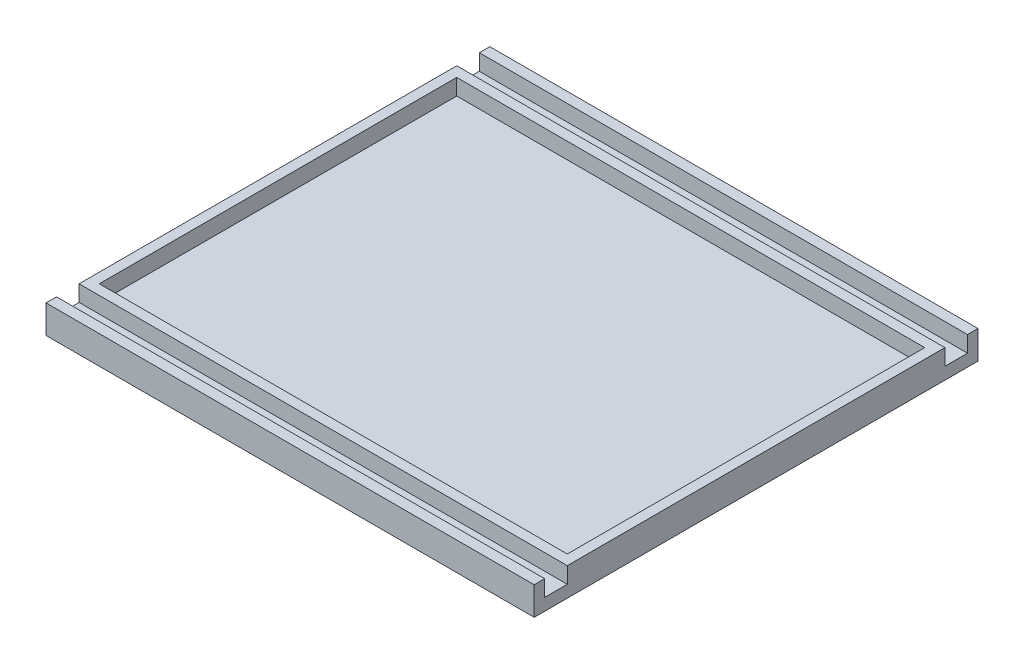
ISO-10303-21;
HEADER;
FILE_DESCRIPTION(('STEP AP214'),'2;1');
FILE_NAME('part.step','',(''),(''),'','','');
FILE_SCHEMA(('AUTOMOTIVE_DESIGN { 1 0 10303 214 1 1 1 1 }'));
ENDSEC;
DATA;
#1=APPLICATION_CONTEXT('core data for automotive mechanical design processes');
#2=APPLICATION_PROTOCOL_DEFINITION('international standard','automotive_design',2000,#1);
#3=PRODUCT_CONTEXT('',#1,'mechanical');
#4=PRODUCT('Part','Part','',(#3));
#5=PRODUCT_RELATED_PRODUCT_CATEGORY('part','',(#4));
#6=PRODUCT_DEFINITION_FORMATION('','',#4);
#7=PRODUCT_DEFINITION_CONTEXT('part definition',#1,'design');
#8=PRODUCT_DEFINITION('design','',#6,#7);
#9=PRODUCT_DEFINITION_SHAPE('','',#8);
#10=(LENGTH_UNIT() NAMED_UNIT(*) SI_UNIT(.MILLI.,.METRE.));
#11=(NAMED_UNIT(*) PLANE_ANGLE_UNIT() SI_UNIT($,.RADIAN.));
#12=(NAMED_UNIT(*) SI_UNIT($,.STERADIAN.) SOLID_ANGLE_UNIT());
#13=UNCERTAINTY_MEASURE_WITH_UNIT(LENGTH_MEASURE(1.E-05),#10,'distance_accuracy_value','');
#14=(GEOMETRIC_REPRESENTATION_CONTEXT(3) GLOBAL_UNCERTAINTY_ASSIGNED_CONTEXT((#13)) GLOBAL_UNIT_ASSIGNED_CONTEXT((#10,
#11,#12)) REPRESENTATION_CONTEXT('',''));
#15=CARTESIAN_POINT('',(0.,0.,0.));
#16=DIRECTION('',(0.,0.,1.));
#17=DIRECTION('',(1.,0.,0.));
#18=AXIS2_PLACEMENT_3D('',#15,#16,#17);
#19=CARTESIAN_POINT('',(0.,1.5,0.));
#20=DIRECTION('',(0.,1.,0.));
#21=DIRECTION('',(0.,0.,1.));
#22=AXIS2_PLACEMENT_3D('',#19,#20,#21);
#23=PLANE('',#22);
#24=DIRECTION('',(0.,0.,1.));
#25=VECTOR('',#24,1.);
#26=CARTESIAN_POINT('',(-30.25,1.5,-27.5));
#27=LINE('',#26,#25);
#28=CARTESIAN_POINT('',(-30.25,1.5,23.4));
#29=VERTEX_POINT('',#28);
#30=CARTESIAN_POINT('',(-30.25,1.5,26.2));
#31=VERTEX_POINT('',#30);
#32=EDGE_CURVE('E262',#29,#31,#27,.T.);
#33=ORIENTED_EDGE('',*,*,#32,.T.);
#34=DIRECTION('',(-1.,0.,0.));
#35=VECTOR('',#34,1.);
#36=CARTESIAN_POINT('',(30.25,1.5,26.2));
#37=LINE('',#36,#35);
#38=CARTESIAN_POINT('',(30.25,1.5,26.2));
#39=VERTEX_POINT('',#38);
#40=EDGE_CURVE('E177',#39,#31,#37,.T.);
#41=ORIENTED_EDGE('',*,*,#40,.F.);
#42=DIRECTION('',(0.,0.,1.));
#43=VECTOR('',#42,1.);
#44=CARTESIAN_POINT('',(30.25,1.5,-27.5));
#45=LINE('',#44,#43);
#46=CARTESIAN_POINT('',(30.25,1.5,23.4));
#47=VERTEX_POINT('',#46);
#48=EDGE_CURVE('E62',#47,#39,#45,.T.);
#49=ORIENTED_EDGE('',*,*,#48,.F.);
#50=DIRECTION('',(1.,0.,0.));
#51=VECTOR('',#50,1.);
#52=CARTESIAN_POINT('',(-30.25,1.5,23.4));
#53=LINE('',#52,#51);
#54=EDGE_CURVE('E238',#29,#47,#53,.T.);
#55=ORIENTED_EDGE('',*,*,#54,.F.);
#56=EDGE_LOOP('',(#33,#41,#49,#55));
#57=FACE_BOUND('',#56,.T.);
#58=ADVANCED_FACE('F39',(#57),#23,.T.);
#59=CARTESIAN_POINT('',(30.25,1.5,-26.2));
#60=VERTEX_POINT('',#59);
#61=CARTESIAN_POINT('',(30.25,1.5,-23.4));
#62=VERTEX_POINT('',#61);
#63=EDGE_CURVE('E263',#60,#62,#45,.T.);
#64=ORIENTED_EDGE('',*,*,#63,.F.);
#65=DIRECTION('',(1.,0.,0.));
#66=VECTOR('',#65,1.);
#67=CARTESIAN_POINT('',(-30.25,1.5,-26.2));
#68=LINE('',#67,#66);
#69=CARTESIAN_POINT('',(-30.25,1.5,-26.2));
#70=VERTEX_POINT('',#69);
#71=EDGE_CURVE('E185',#70,#60,#68,.T.);
#72=ORIENTED_EDGE('',*,*,#71,.F.);
#73=CARTESIAN_POINT('',(-30.25,1.5,-23.4));
#74=VERTEX_POINT('',#73);
#75=EDGE_CURVE('E260',#70,#74,#27,.T.);
#76=ORIENTED_EDGE('',*,*,#75,.T.);
#77=DIRECTION('',(-1.,0.,0.));
#78=VECTOR('',#77,1.);
#79=CARTESIAN_POINT('',(-30.25,1.5,-23.4));
#80=LINE('',#79,#78);
#81=EDGE_CURVE('E233',#62,#74,#80,.T.);
#82=ORIENTED_EDGE('',*,*,#81,.F.);
#83=EDGE_LOOP('',(#64,#72,#76,#82));
#84=FACE_BOUND('',#83,.T.);
#85=ADVANCED_FACE('F295',(#84),#23,.T.);
#86=CARTESIAN_POINT('',(-30.25,1.5,-27.5));
#87=DIRECTION('',(1.,0.,0.));
#88=DIRECTION('',(0.,0.,-1.));
#89=AXIS2_PLACEMENT_3D('',#86,#87,#88);
#90=PLANE('',#89);
#91=DIRECTION('',(0.,0.,1.));
#92=VECTOR('',#91,1.);
#93=CARTESIAN_POINT('',(-30.25,0.,-27.5));
#94=LINE('',#93,#92);
#95=CARTESIAN_POINT('',(-30.25,0.,-27.5));
#96=VERTEX_POINT('',#95);
#97=CARTESIAN_POINT('',(-30.25,0.,27.5));
#98=VERTEX_POINT('',#97);
#99=EDGE_CURVE('E259',#96,#98,#94,.T.);
#100=ORIENTED_EDGE('',*,*,#99,.T.);
#101=DIRECTION('',(0.,-1.,0.));
#102=VECTOR('',#101,1.);
#103=CARTESIAN_POINT('',(-30.25,1.5,27.5));
#104=LINE('',#103,#102);
#105=CARTESIAN_POINT('',(-30.25,3.5,27.5));
#106=VERTEX_POINT('',#105);
#107=EDGE_CURVE('E11',#106,#98,#104,.T.);
#108=ORIENTED_EDGE('',*,*,#107,.F.);
#109=DIRECTION('',(0.,0.,1.));
#110=VECTOR('',#109,1.);
#111=CARTESIAN_POINT('',(-30.25,3.5,27.5));
#112=LINE('',#111,#110);
#113=CARTESIAN_POINT('',(-30.25,3.5,26.2));
#114=VERTEX_POINT('',#113);
#115=EDGE_CURVE('E174',#114,#106,#112,.T.);
#116=ORIENTED_EDGE('',*,*,#115,.F.);
#117=DIRECTION('',(0.,-1.,0.));
#118=VECTOR('',#117,1.);
#119=CARTESIAN_POINT('',(-30.25,64.0139653303268,26.2));
#120=LINE('',#119,#118);
#121=EDGE_CURVE('E175',#114,#31,#120,.T.);
#122=ORIENTED_EDGE('',*,*,#121,.T.);
#123=ORIENTED_EDGE('',*,*,#32,.F.);
#124=DIRECTION('',(0.,-1.,0.));
#125=VECTOR('',#124,1.);
#126=CARTESIAN_POINT('',(-30.25,3.5,23.4));
#127=LINE('',#126,#125);
#128=CARTESIAN_POINT('',(-30.25,3.5,23.4));
#129=VERTEX_POINT('',#128);
#130=EDGE_CURVE('E250',#129,#29,#127,.T.);
#131=ORIENTED_EDGE('',*,*,#130,.F.);
#132=DIRECTION('',(0.,0.,1.));
#133=VECTOR('',#132,1.);
#134=CARTESIAN_POINT('',(-30.25,3.5,-23.4));
#135=LINE('',#134,#133);
#136=CARTESIAN_POINT('',(-30.25,3.5,-23.4));
#137=VERTEX_POINT('',#136);
#138=EDGE_CURVE('E240',#137,#129,#135,.T.);
#139=ORIENTED_EDGE('',*,*,#138,.F.);
#140=DIRECTION('',(0.,-1.,0.));
#141=VECTOR('',#140,1.);
#142=CARTESIAN_POINT('',(-30.25,3.5,-23.4));
#143=LINE('',#142,#141);
#144=EDGE_CURVE('E253',#137,#74,#143,.T.);
#145=ORIENTED_EDGE('',*,*,#144,.T.);
#146=ORIENTED_EDGE('',*,*,#75,.F.);
#147=DIRECTION('',(0.,-1.,0.));
#148=VECTOR('',#147,1.);
#149=CARTESIAN_POINT('',(-30.25,64.0139653303268,-26.2));
#150=LINE('',#149,#148);
#151=CARTESIAN_POINT('',(-30.25,3.5,-26.2));
#152=VERTEX_POINT('',#151);
#153=EDGE_CURVE('E189',#152,#70,#150,.T.);
#154=ORIENTED_EDGE('',*,*,#153,.F.);
#155=DIRECTION('',(0.,0.,1.));
#156=VECTOR('',#155,1.);
#157=CARTESIAN_POINT('',(-30.25,3.5,-27.5));
#158=LINE('',#157,#156);
#159=CARTESIAN_POINT('',(-30.25,3.5,-27.5));
#160=VERTEX_POINT('',#159);
#161=EDGE_CURVE('E197',#160,#152,#158,.T.);
#162=ORIENTED_EDGE('',*,*,#161,.F.);
#163=DIRECTION('',(0.,-1.,0.));
#164=VECTOR('',#163,1.);
#165=CARTESIAN_POINT('',(-30.25,1.5,-27.5));
#166=LINE('',#165,#164);
#167=EDGE_CURVE('E265',#160,#96,#166,.T.);
#168=ORIENTED_EDGE('',*,*,#167,.T.);
#169=EDGE_LOOP('',(#100,#108,#116,#122,#123,#131,#139,#145,#146,#154,#162,#168));
#170=FACE_BOUND('',#169,.T.);
#171=ADVANCED_FACE('F41',(#170),#90,.F.);
#172=CARTESIAN_POINT('',(-30.25,1.5,27.5));
#173=DIRECTION('',(0.,0.,-1.));
#174=DIRECTION('',(-1.,0.,0.));
#175=AXIS2_PLACEMENT_3D('',#172,#173,#174);
#176=PLANE('',#175);
#177=DIRECTION('',(1.,0.,0.));
#178=VECTOR('',#177,1.);
#179=CARTESIAN_POINT('',(-30.25,0.,27.5));
#180=LINE('',#179,#178);
#181=CARTESIAN_POINT('',(30.25,0.,27.5));
#182=VERTEX_POINT('',#181);
#183=EDGE_CURVE('E159',#98,#182,#180,.T.);
#184=ORIENTED_EDGE('',*,*,#183,.T.);
#185=DIRECTION('',(0.,-1.,0.));
#186=VECTOR('',#185,1.);
#187=CARTESIAN_POINT('',(30.25,1.5,27.5));
#188=LINE('',#187,#186);
#189=CARTESIAN_POINT('',(30.25,3.5,27.5));
#190=VERTEX_POINT('',#189);
#191=EDGE_CURVE('E47',#190,#182,#188,.T.);
#192=ORIENTED_EDGE('',*,*,#191,.F.);
#193=DIRECTION('',(1.,0.,0.));
#194=VECTOR('',#193,1.);
#195=CARTESIAN_POINT('',(30.25,3.5,27.5));
#196=LINE('',#195,#194);
#197=EDGE_CURVE('E157',#106,#190,#196,.T.);
#198=ORIENTED_EDGE('',*,*,#197,.F.);
#199=ORIENTED_EDGE('',*,*,#107,.T.);
#200=EDGE_LOOP('',(#184,#192,#198,#199));
#201=FACE_BOUND('',#200,.T.);
#202=ADVANCED_FACE('F155',(#201),#176,.F.);
#203=CARTESIAN_POINT('',(30.25,1.5,-27.5));
#204=DIRECTION('',(1.,0.,0.));
#205=DIRECTION('',(0.,0.,-1.));
#206=AXIS2_PLACEMENT_3D('',#203,#204,#205);
#207=PLANE('',#206);
#208=DIRECTION('',(0.,0.,1.));
#209=VECTOR('',#208,1.);
#210=CARTESIAN_POINT('',(30.25,0.,-27.5));
#211=LINE('',#210,#209);
#212=CARTESIAN_POINT('',(30.25,0.,-27.5));
#213=VERTEX_POINT('',#212);
#214=EDGE_CURVE('E269',#213,#182,#211,.T.);
#215=ORIENTED_EDGE('',*,*,#214,.F.);
#216=DIRECTION('',(0.,-1.,0.));
#217=VECTOR('',#216,1.);
#218=CARTESIAN_POINT('',(30.25,1.5,-27.5));
#219=LINE('',#218,#217);
#220=CARTESIAN_POINT('',(30.25,3.5,-27.5));
#221=VERTEX_POINT('',#220);
#222=EDGE_CURVE('E163',#221,#213,#219,.T.);
#223=ORIENTED_EDGE('',*,*,#222,.F.);
#224=DIRECTION('',(0.,0.,-1.));
#225=VECTOR('',#224,1.);
#226=CARTESIAN_POINT('',(30.25,3.5,-27.5));
#227=LINE('',#226,#225);
#228=CARTESIAN_POINT('',(30.25,3.5,-26.2));
#229=VERTEX_POINT('',#228);
#230=EDGE_CURVE('E190',#229,#221,#227,.T.);
#231=ORIENTED_EDGE('',*,*,#230,.F.);
#232=DIRECTION('',(0.,-1.,0.));
#233=VECTOR('',#232,1.);
#234=CARTESIAN_POINT('',(30.25,64.0139653303268,-26.2));
#235=LINE('',#234,#233);
#236=EDGE_CURVE('E188',#229,#60,#235,.T.);
#237=ORIENTED_EDGE('',*,*,#236,.T.);
#238=ORIENTED_EDGE('',*,*,#63,.T.);
#239=DIRECTION('',(0.,-1.,0.));
#240=VECTOR('',#239,1.);
#241=CARTESIAN_POINT('',(30.25,3.5,-23.4));
#242=LINE('',#241,#240);
#243=CARTESIAN_POINT('',(30.25,3.5,-23.4));
#244=VERTEX_POINT('',#243);
#245=EDGE_CURVE('E256',#244,#62,#242,.T.);
#246=ORIENTED_EDGE('',*,*,#245,.F.);
#247=DIRECTION('',(0.,0.,-1.));
#248=VECTOR('',#247,1.);
#249=CARTESIAN_POINT('',(30.25,3.5,-23.4));
#250=LINE('',#249,#248);
#251=CARTESIAN_POINT('',(30.25,3.5,23.4));
#252=VERTEX_POINT('',#251);
#253=EDGE_CURVE('E234',#252,#244,#250,.T.);
#254=ORIENTED_EDGE('',*,*,#253,.F.);
#255=DIRECTION('',(0.,-1.,0.));
#256=VECTOR('',#255,1.);
#257=CARTESIAN_POINT('',(30.25,3.5,23.4));
#258=LINE('',#257,#256);
#259=EDGE_CURVE('E244',#252,#47,#258,.T.);
#260=ORIENTED_EDGE('',*,*,#259,.T.);
#261=ORIENTED_EDGE('',*,*,#48,.T.);
#262=DIRECTION('',(0.,-1.,0.));
#263=VECTOR('',#262,1.);
#264=CARTESIAN_POINT('',(30.25,64.0139653303268,26.2));
#265=LINE('',#264,#263);
#266=CARTESIAN_POINT('',(30.25,3.5,26.2));
#267=VERTEX_POINT('',#266);
#268=EDGE_CURVE('E168',#267,#39,#265,.T.);
#269=ORIENTED_EDGE('',*,*,#268,.F.);
#270=DIRECTION('',(0.,0.,-1.));
#271=VECTOR('',#270,1.);
#272=CARTESIAN_POINT('',(30.25,3.5,27.5));
#273=LINE('',#272,#271);
#274=EDGE_CURVE('E166',#190,#267,#273,.T.);
#275=ORIENTED_EDGE('',*,*,#274,.F.);
#276=ORIENTED_EDGE('',*,*,#191,.T.);
#277=EDGE_LOOP('',(#215,#223,#231,#237,#238,#246,#254,#260,#261,#269,#275,#276));
#278=FACE_BOUND('',#277,.T.);
#279=ADVANCED_FACE('F167',(#278),#207,.T.);
#280=CARTESIAN_POINT('',(-30.25,1.5,-27.5));
#281=DIRECTION('',(0.,0.,-1.));
#282=DIRECTION('',(-1.,0.,0.));
#283=AXIS2_PLACEMENT_3D('',#280,#281,#282);
#284=PLANE('',#283);
#285=DIRECTION('',(1.,0.,0.));
#286=VECTOR('',#285,1.);
#287=CARTESIAN_POINT('',(-30.25,0.,-27.5));
#288=LINE('',#287,#286);
#289=EDGE_CURVE('E271',#96,#213,#288,.T.);
#290=ORIENTED_EDGE('',*,*,#289,.F.);
#291=ORIENTED_EDGE('',*,*,#167,.F.);
#292=DIRECTION('',(-1.,0.,0.));
#293=VECTOR('',#292,1.);
#294=CARTESIAN_POINT('',(-30.25,3.5,-27.5));
#295=LINE('',#294,#293);
#296=EDGE_CURVE('E200',#221,#160,#295,.T.);
#297=ORIENTED_EDGE('',*,*,#296,.F.);
#298=ORIENTED_EDGE('',*,*,#222,.T.);
#299=EDGE_LOOP('',(#290,#291,#297,#298));
#300=FACE_BOUND('',#299,.T.);
#301=ADVANCED_FACE('F278',(#300),#284,.T.);
#302=CARTESIAN_POINT('',(0.,0.,0.));
#303=DIRECTION('',(0.,1.,0.));
#304=DIRECTION('',(0.,0.,1.));
#305=AXIS2_PLACEMENT_3D('',#302,#303,#304);
#306=PLANE('',#305);
#307=ORIENTED_EDGE('',*,*,#99,.F.);
#308=ORIENTED_EDGE('',*,*,#289,.T.);
#309=ORIENTED_EDGE('',*,*,#214,.T.);
#310=ORIENTED_EDGE('',*,*,#183,.F.);
#311=EDGE_LOOP('',(#307,#308,#309,#310));
#312=FACE_BOUND('',#311,.T.);
#313=ADVANCED_FACE('F281',(#312),#306,.F.);
#314=CARTESIAN_POINT('',(0.,3.5,0.));
#315=DIRECTION('',(0.,1.,0.));
#316=DIRECTION('',(0.,0.,1.));
#317=AXIS2_PLACEMENT_3D('',#314,#315,#316);
#318=PLANE('',#317);
#319=ORIENTED_EDGE('',*,*,#253,.T.);
#320=DIRECTION('',(-1.,0.,0.));
#321=VECTOR('',#320,1.);
#322=CARTESIAN_POINT('',(-30.25,3.5,-23.4));
#323=LINE('',#322,#321);
#324=EDGE_CURVE('E237',#244,#137,#323,.T.);
#325=ORIENTED_EDGE('',*,*,#324,.T.);
#326=ORIENTED_EDGE('',*,*,#138,.T.);
#327=DIRECTION('',(1.,0.,0.));
#328=VECTOR('',#327,1.);
#329=CARTESIAN_POINT('',(-30.25,3.5,23.4));
#330=LINE('',#329,#328);
#331=EDGE_CURVE('E242',#129,#252,#330,.T.);
#332=ORIENTED_EDGE('',*,*,#331,.T.);
#333=EDGE_LOOP('',(#319,#325,#326,#332));
#334=FACE_BOUND('',#333,.T.);
#335=DIRECTION('',(-1.,0.,0.));
#336=VECTOR('',#335,1.);
#337=CARTESIAN_POINT('',(-29.,3.5,-22.15));
#338=LINE('',#337,#336);
#339=CARTESIAN_POINT('',(29.,3.5,-22.15));
#340=VERTEX_POINT('',#339);
#341=CARTESIAN_POINT('',(-29.,3.5,-22.15));
#342=VERTEX_POINT('',#341);
#343=EDGE_CURVE('E207',#340,#342,#338,.T.);
#344=ORIENTED_EDGE('',*,*,#343,.F.);
#345=DIRECTION('',(0.,0.,-1.));
#346=VECTOR('',#345,1.);
#347=CARTESIAN_POINT('',(29.,3.5,-22.15));
#348=LINE('',#347,#346);
#349=CARTESIAN_POINT('',(29.,3.5,22.15));
#350=VERTEX_POINT('',#349);
#351=EDGE_CURVE('E205',#350,#340,#348,.T.);
#352=ORIENTED_EDGE('',*,*,#351,.F.);
#353=DIRECTION('',(1.,0.,0.));
#354=VECTOR('',#353,1.);
#355=CARTESIAN_POINT('',(-29.,3.5,22.15));
#356=LINE('',#355,#354);
#357=CARTESIAN_POINT('',(-29.,3.5,22.15));
#358=VERTEX_POINT('',#357);
#359=EDGE_CURVE('E213',#358,#350,#356,.T.);
#360=ORIENTED_EDGE('',*,*,#359,.F.);
#361=DIRECTION('',(0.,0.,1.));
#362=VECTOR('',#361,1.);
#363=CARTESIAN_POINT('',(-29.,3.5,-22.15));
#364=LINE('',#363,#362);
#365=EDGE_CURVE('E210',#342,#358,#364,.T.);
#366=ORIENTED_EDGE('',*,*,#365,.F.);
#367=EDGE_LOOP('',(#344,#352,#360,#366));
#368=FACE_BOUND('',#367,.T.);
#369=ADVANCED_FACE('F303',(#334,#368),#318,.T.);
#370=CARTESIAN_POINT('',(-30.25,3.5,-23.4));
#371=DIRECTION('',(0.,0.,1.));
#372=DIRECTION('',(1.,0.,0.));
#373=AXIS2_PLACEMENT_3D('',#370,#371,#372);
#374=PLANE('',#373);
#375=ORIENTED_EDGE('',*,*,#81,.T.);
#376=ORIENTED_EDGE('',*,*,#144,.F.);
#377=ORIENTED_EDGE('',*,*,#324,.F.);
#378=ORIENTED_EDGE('',*,*,#245,.T.);
#379=EDGE_LOOP('',(#375,#376,#377,#378));
#380=FACE_BOUND('',#379,.T.);
#381=ADVANCED_FACE('F299',(#380),#374,.F.);
#382=CARTESIAN_POINT('',(-30.25,3.5,23.4));
#383=DIRECTION('',(0.,0.,-1.));
#384=DIRECTION('',(-1.,0.,0.));
#385=AXIS2_PLACEMENT_3D('',#382,#383,#384);
#386=PLANE('',#385);
#387=ORIENTED_EDGE('',*,*,#54,.T.);
#388=ORIENTED_EDGE('',*,*,#259,.F.);
#389=ORIENTED_EDGE('',*,*,#331,.F.);
#390=ORIENTED_EDGE('',*,*,#130,.T.);
#391=EDGE_LOOP('',(#387,#388,#389,#390));
#392=FACE_BOUND('',#391,.T.);
#393=ADVANCED_FACE('F309',(#392),#386,.F.);
#394=CARTESIAN_POINT('',(29.,3.5,-22.15));
#395=DIRECTION('',(-1.,0.,0.));
#396=DIRECTION('',(0.,0.,1.));
#397=AXIS2_PLACEMENT_3D('',#394,#395,#396);
#398=PLANE('',#397);
#399=DIRECTION('',(0.,0.,-1.));
#400=VECTOR('',#399,1.);
#401=CARTESIAN_POINT('',(29.,1.5,-22.15));
#402=LINE('',#401,#400);
#403=CARTESIAN_POINT('',(29.,1.5,22.15));
#404=VERTEX_POINT('',#403);
#405=CARTESIAN_POINT('',(29.,1.5,-22.15));
#406=VERTEX_POINT('',#405);
#407=EDGE_CURVE('E193',#404,#406,#402,.T.);
#408=ORIENTED_EDGE('',*,*,#407,.F.);
#409=DIRECTION('',(0.,-1.,0.));
#410=VECTOR('',#409,1.);
#411=CARTESIAN_POINT('',(29.,3.5,22.15));
#412=LINE('',#411,#410);
#413=EDGE_CURVE('E54',#350,#404,#412,.T.);
#414=ORIENTED_EDGE('',*,*,#413,.F.);
#415=ORIENTED_EDGE('',*,*,#351,.T.);
#416=DIRECTION('',(0.,-1.,0.));
#417=VECTOR('',#416,1.);
#418=CARTESIAN_POINT('',(29.,3.5,-22.15));
#419=LINE('',#418,#417);
#420=EDGE_CURVE('E230',#340,#406,#419,.T.);
#421=ORIENTED_EDGE('',*,*,#420,.T.);
#422=EDGE_LOOP('',(#408,#414,#415,#421));
#423=FACE_BOUND('',#422,.T.);
#424=ADVANCED_FACE('F350',(#423),#398,.T.);
#425=CARTESIAN_POINT('',(-29.,3.5,-22.15));
#426=DIRECTION('',(0.,0.,1.));
#427=DIRECTION('',(1.,0.,0.));
#428=AXIS2_PLACEMENT_3D('',#425,#426,#427);
#429=PLANE('',#428);
#430=DIRECTION('',(-1.,0.,0.));
#431=VECTOR('',#430,1.);
#432=CARTESIAN_POINT('',(-29.,1.5,-22.15));
#433=LINE('',#432,#431);
#434=CARTESIAN_POINT('',(-29.,1.5,-22.15));
#435=VERTEX_POINT('',#434);
#436=EDGE_CURVE('E217',#406,#435,#433,.T.);
#437=ORIENTED_EDGE('',*,*,#436,.F.);
#438=ORIENTED_EDGE('',*,*,#420,.F.);
#439=ORIENTED_EDGE('',*,*,#343,.T.);
#440=DIRECTION('',(0.,-1.,0.));
#441=VECTOR('',#440,1.);
#442=CARTESIAN_POINT('',(-29.,3.5,-22.15));
#443=LINE('',#442,#441);
#444=EDGE_CURVE('E228',#342,#435,#443,.T.);
#445=ORIENTED_EDGE('',*,*,#444,.T.);
#446=EDGE_LOOP('',(#437,#438,#439,#445));
#447=FACE_BOUND('',#446,.T.);
#448=ADVANCED_FACE('F352',(#447),#429,.T.);
#449=CARTESIAN_POINT('',(-29.,3.5,-22.15));
#450=DIRECTION('',(1.,0.,0.));
#451=DIRECTION('',(0.,0.,-1.));
#452=AXIS2_PLACEMENT_3D('',#449,#450,#451);
#453=PLANE('',#452);
#454=DIRECTION('',(0.,0.,1.));
#455=VECTOR('',#454,1.);
#456=CARTESIAN_POINT('',(-29.,1.5,-22.15));
#457=LINE('',#456,#455);
#458=CARTESIAN_POINT('',(-29.,1.5,22.15));
#459=VERTEX_POINT('',#458);
#460=EDGE_CURVE('E220',#435,#459,#457,.T.);
#461=ORIENTED_EDGE('',*,*,#460,.F.);
#462=ORIENTED_EDGE('',*,*,#444,.F.);
#463=ORIENTED_EDGE('',*,*,#365,.T.);
#464=DIRECTION('',(0.,-1.,0.));
#465=VECTOR('',#464,1.);
#466=CARTESIAN_POINT('',(-29.,3.5,22.15));
#467=LINE('',#466,#465);
#468=EDGE_CURVE('E226',#358,#459,#467,.T.);
#469=ORIENTED_EDGE('',*,*,#468,.T.);
#470=EDGE_LOOP('',(#461,#462,#463,#469));
#471=FACE_BOUND('',#470,.T.);
#472=ADVANCED_FACE('F339',(#471),#453,.T.);
#473=CARTESIAN_POINT('',(-29.,3.5,22.15));
#474=DIRECTION('',(0.,0.,-1.));
#475=DIRECTION('',(-1.,0.,0.));
#476=AXIS2_PLACEMENT_3D('',#473,#474,#475);
#477=PLANE('',#476);
#478=DIRECTION('',(1.,0.,0.));
#479=VECTOR('',#478,1.);
#480=CARTESIAN_POINT('',(-29.,1.5,22.15));
#481=LINE('',#480,#479);
#482=EDGE_CURVE('E208',#459,#404,#481,.T.);
#483=ORIENTED_EDGE('',*,*,#482,.F.);
#484=ORIENTED_EDGE('',*,*,#468,.F.);
#485=ORIENTED_EDGE('',*,*,#359,.T.);
#486=ORIENTED_EDGE('',*,*,#413,.T.);
#487=EDGE_LOOP('',(#483,#484,#485,#486));
#488=FACE_BOUND('',#487,.T.);
#489=ADVANCED_FACE('F333',(#488),#477,.T.);
#490=ORIENTED_EDGE('',*,*,#482,.T.);
#491=ORIENTED_EDGE('',*,*,#407,.T.);
#492=ORIENTED_EDGE('',*,*,#436,.T.);
#493=ORIENTED_EDGE('',*,*,#460,.T.);
#494=EDGE_LOOP('',(#490,#491,#492,#493));
#495=FACE_BOUND('',#494,.T.);
#496=ADVANCED_FACE('F326',(#495),#23,.T.);
#497=CARTESIAN_POINT('',(-30.25,64.0139653303268,-26.2));
#498=DIRECTION('',(0.,0.,-1.));
#499=DIRECTION('',(-1.,0.,0.));
#500=AXIS2_PLACEMENT_3D('',#497,#498,#499);
#501=PLANE('',#500);
#502=DIRECTION('',(1.,0.,0.));
#503=VECTOR('',#502,1.);
#504=CARTESIAN_POINT('',(-30.25,3.5,-26.2));
#505=LINE('',#504,#503);
#506=EDGE_CURVE('E194',#152,#229,#505,.T.);
#507=ORIENTED_EDGE('',*,*,#506,.F.);
#508=ORIENTED_EDGE('',*,*,#153,.T.);
#509=ORIENTED_EDGE('',*,*,#71,.T.);
#510=ORIENTED_EDGE('',*,*,#236,.F.);
#511=EDGE_LOOP('',(#507,#508,#509,#510));
#512=FACE_BOUND('',#511,.T.);
#513=ADVANCED_FACE('F290',(#512),#501,.F.);
#514=CARTESIAN_POINT('',(0.,3.5,0.));
#515=DIRECTION('',(0.,1.,0.));
#516=DIRECTION('',(0.,0.,1.));
#517=AXIS2_PLACEMENT_3D('',#514,#515,#516);
#518=PLANE('',#517);
#519=ORIENTED_EDGE('',*,*,#296,.T.);
#520=ORIENTED_EDGE('',*,*,#161,.T.);
#521=ORIENTED_EDGE('',*,*,#506,.T.);
#522=ORIENTED_EDGE('',*,*,#230,.T.);
#523=EDGE_LOOP('',(#519,#520,#521,#522));
#524=FACE_BOUND('',#523,.T.);
#525=ADVANCED_FACE('F287',(#524),#518,.T.);
#526=CARTESIAN_POINT('',(30.25,64.0139653303268,26.2));
#527=DIRECTION('',(0.,0.,1.));
#528=DIRECTION('',(1.,0.,0.));
#529=AXIS2_PLACEMENT_3D('',#526,#527,#528);
#530=PLANE('',#529);
#531=DIRECTION('',(-1.,0.,0.));
#532=VECTOR('',#531,1.);
#533=CARTESIAN_POINT('',(30.25,3.5,26.2));
#534=LINE('',#533,#532);
#535=EDGE_CURVE('E171',#267,#114,#534,.T.);
#536=ORIENTED_EDGE('',*,*,#535,.F.);
#537=ORIENTED_EDGE('',*,*,#268,.T.);
#538=ORIENTED_EDGE('',*,*,#40,.T.);
#539=ORIENTED_EDGE('',*,*,#121,.F.);
#540=EDGE_LOOP('',(#536,#537,#538,#539));
#541=FACE_BOUND('',#540,.T.);
#542=ADVANCED_FACE('F314',(#541),#530,.F.);
#543=CARTESIAN_POINT('',(0.,3.5,0.));
#544=DIRECTION('',(0.,1.,0.));
#545=DIRECTION('',(0.,0.,1.));
#546=AXIS2_PLACEMENT_3D('',#543,#544,#545);
#547=PLANE('',#546);
#548=ORIENTED_EDGE('',*,*,#197,.T.);
#549=ORIENTED_EDGE('',*,*,#274,.T.);
#550=ORIENTED_EDGE('',*,*,#535,.T.);
#551=ORIENTED_EDGE('',*,*,#115,.T.);
#552=EDGE_LOOP('',(#548,#549,#550,#551));
#553=FACE_BOUND('',#552,.T.);
#554=ADVANCED_FACE('F173',(#553),#547,.T.);
#555=CLOSED_SHELL('',(#58,#85,#171,#202,#279,#301,#313,#369,#381,#393,#424,#448,#472,#489,#496,
#513,#525,#542,#554));
#556=MANIFOLD_SOLID_BREP('B2',#555);
#557=ADVANCED_BREP_SHAPE_REPRESENTATION('',(#18,#556),#14);
#558=SHAPE_DEFINITION_REPRESENTATION(#9,#557);
ENDSEC;
END-ISO-10303-21;
